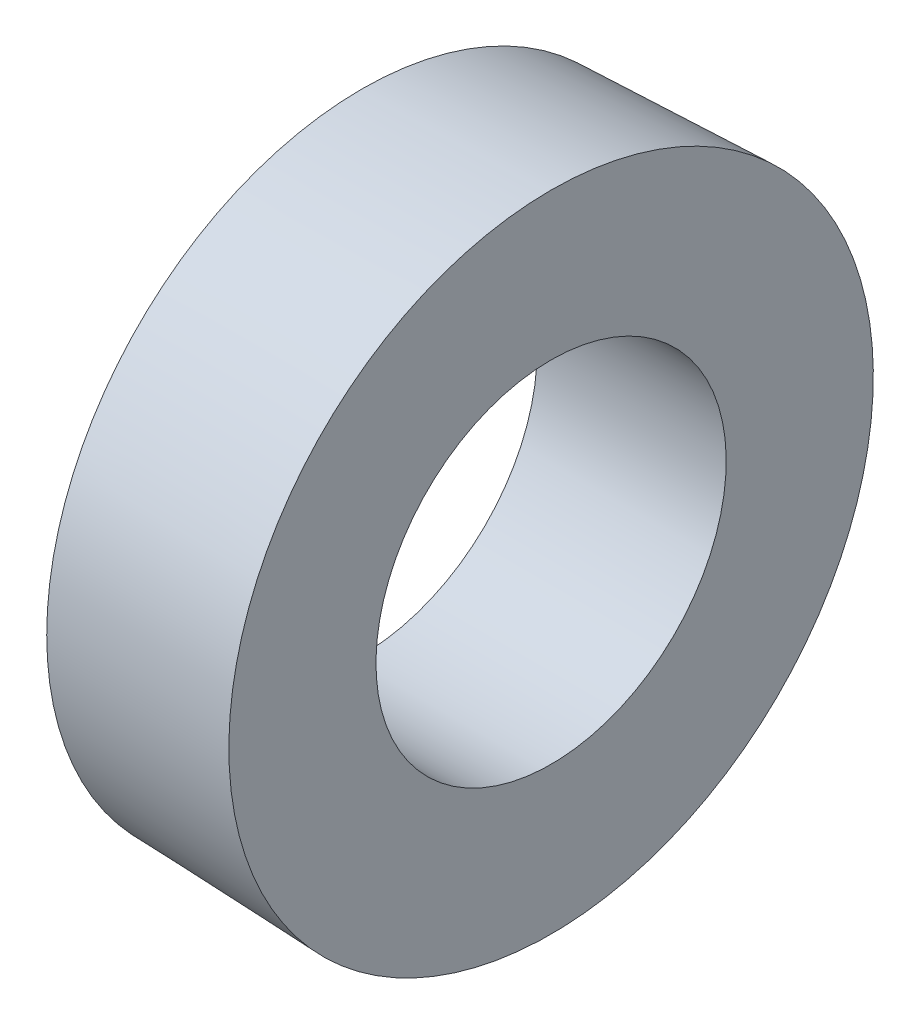
ISO-10303-21;
HEADER;
FILE_DESCRIPTION(('STEP AP214'),'2;1');
FILE_NAME('part.step','',(''),(''),'','','');
FILE_SCHEMA(('AUTOMOTIVE_DESIGN { 1 0 10303 214 1 1 1 1 }'));
ENDSEC;
DATA;
#1=APPLICATION_CONTEXT('core data for automotive mechanical design processes');
#2=APPLICATION_PROTOCOL_DEFINITION('international standard','automotive_design',2000,#1);
#3=PRODUCT_CONTEXT('',#1,'mechanical');
#4=PRODUCT('Part','Part','',(#3));
#5=PRODUCT_RELATED_PRODUCT_CATEGORY('part','',(#4));
#6=PRODUCT_DEFINITION_FORMATION('','',#4);
#7=PRODUCT_DEFINITION_CONTEXT('part definition',#1,'design');
#8=PRODUCT_DEFINITION('design','',#6,#7);
#9=PRODUCT_DEFINITION_SHAPE('','',#8);
#10=(LENGTH_UNIT() NAMED_UNIT(*) SI_UNIT(.MILLI.,.METRE.));
#11=(NAMED_UNIT(*) PLANE_ANGLE_UNIT() SI_UNIT($,.RADIAN.));
#12=(NAMED_UNIT(*) SI_UNIT($,.STERADIAN.) SOLID_ANGLE_UNIT());
#13=UNCERTAINTY_MEASURE_WITH_UNIT(LENGTH_MEASURE(1.E-05),#10,'distance_accuracy_value','');
#14=(GEOMETRIC_REPRESENTATION_CONTEXT(3) GLOBAL_UNCERTAINTY_ASSIGNED_CONTEXT((#13)) GLOBAL_UNIT_ASSIGNED_CONTEXT((#10,
#11,#12)) REPRESENTATION_CONTEXT('',''));
#15=CARTESIAN_POINT('',(0.,0.,0.));
#16=DIRECTION('',(0.,0.,1.));
#17=DIRECTION('',(1.,0.,0.));
#18=AXIS2_PLACEMENT_3D('',#15,#16,#17);
#19=CARTESIAN_POINT('',(0.,0.,0.));
#20=DIRECTION('',(-1.,0.,0.));
#21=DIRECTION('',(0.,0.,1.));
#22=AXIS2_PLACEMENT_3D('',#19,#20,#21);
#23=CYLINDRICAL_SURFACE('',#22,250.);
#24=CARTESIAN_POINT('',(4480.,0.,0.));
#25=DIRECTION('',(-1.,0.,0.));
#26=DIRECTION('',(0.,0.,1.));
#27=AXIS2_PLACEMENT_3D('',#24,#25,#26);
#28=CIRCLE('',#27,250.);
#29=CARTESIAN_POINT('',(4480.,250.,-1.79489651492081E-06));
#30=VERTEX_POINT('',#29);
#31=CARTESIAN_POINT('',(4480.,250.,0.));
#32=VERTEX_POINT('',#31);
#33=EDGE_CURVE('E11',#30,#32,#28,.T.);
#34=ORIENTED_EDGE('',*,*,#33,.T.);
#35=DIRECTION('',(1.,0.,0.));
#36=VECTOR('',#35,1.);
#37=CARTESIAN_POINT('',(4750.,250.,0.));
#38=LINE('',#37,#36);
#39=CARTESIAN_POINT('',(4750.,250.,0.));
#40=VERTEX_POINT('',#39);
#41=EDGE_CURVE('E100',#32,#40,#38,.T.);
#42=ORIENTED_EDGE('',*,*,#41,.T.);
#43=CARTESIAN_POINT('',(4750.,0.,0.));
#44=DIRECTION('',(-1.,0.,0.));
#45=DIRECTION('',(0.,0.,1.));
#46=AXIS2_PLACEMENT_3D('',#43,#44,#45);
#47=CIRCLE('',#46,250.);
#48=CARTESIAN_POINT('',(4750.,250.,-1.79489651492081E-06));
#49=VERTEX_POINT('',#48);
#50=EDGE_CURVE('E80',#49,#40,#47,.T.);
#51=ORIENTED_EDGE('',*,*,#50,.F.);
#52=DIRECTION('',(1.,0.,0.));
#53=VECTOR('',#52,1.);
#54=CARTESIAN_POINT('',(4750.,250.,-1.79489651492081E-06));
#55=LINE('',#54,#53);
#56=EDGE_CURVE('E103',#30,#49,#55,.T.);
#57=ORIENTED_EDGE('',*,*,#56,.F.);
#58=EDGE_LOOP('',(#34,#42,#51,#57));
#59=FACE_BOUND('',#58,.T.);
#60=ADVANCED_FACE('F39',(#59),#23,.F.);
#61=CARTESIAN_POINT('',(4480.,250.,-1.79489651492081E-06));
#62=DIRECTION('',(1.,0.,0.));
#63=DIRECTION('',(0.,0.,-1.));
#64=AXIS2_PLACEMENT_3D('',#61,#62,#63);
#65=PLANE('',#64);
#66=CARTESIAN_POINT('',(4480.,0.,0.));
#67=DIRECTION('',(-1.,0.,0.));
#68=DIRECTION('',(0.,0.,1.));
#69=AXIS2_PLACEMENT_3D('',#66,#67,#68);
#70=CIRCLE('',#69,450.);
#71=CARTESIAN_POINT('',(4480.,450.,-3.23081372685745E-06));
#72=VERTEX_POINT('',#71);
#73=CARTESIAN_POINT('',(4480.,450.,0.));
#74=VERTEX_POINT('',#73);
#75=EDGE_CURVE('E50',#72,#74,#70,.T.);
#76=ORIENTED_EDGE('',*,*,#75,.T.);
#77=DIRECTION('',(0.,-1.,0.));
#78=VECTOR('',#77,1.);
#79=CARTESIAN_POINT('',(4480.,250.,0.));
#80=LINE('',#79,#78);
#81=EDGE_CURVE('E104',#74,#32,#80,.T.);
#82=ORIENTED_EDGE('',*,*,#81,.T.);
#83=ORIENTED_EDGE('',*,*,#33,.F.);
#84=DIRECTION('',(0.,-1.,7.17958605968322E-09));
#85=VECTOR('',#84,1.);
#86=CARTESIAN_POINT('',(4480.,250.,-1.79489651492081E-06));
#87=LINE('',#86,#85);
#88=EDGE_CURVE('E91',#72,#30,#87,.T.);
#89=ORIENTED_EDGE('',*,*,#88,.F.);
#90=EDGE_LOOP('',(#76,#82,#83,#89));
#91=FACE_BOUND('',#90,.T.);
#92=ADVANCED_FACE('F41',(#91),#65,.F.);
#93=CARTESIAN_POINT('',(4750.,0.,0.));
#94=DIRECTION('',(1.,0.,0.));
#95=DIRECTION('',(0.,0.,-1.));
#96=AXIS2_PLACEMENT_3D('',#93,#94,#95);
#97=CONICAL_SURFACE('',#96,460.,0.0370201158739301);
#98=CARTESIAN_POINT('',(4750.,0.,0.));
#99=DIRECTION('',(-1.,0.,0.));
#100=DIRECTION('',(0.,0.,1.));
#101=AXIS2_PLACEMENT_3D('',#98,#99,#100);
#102=CIRCLE('',#101,460.);
#103=CARTESIAN_POINT('',(4750.,460.,-3.30260958745428E-06));
#104=VERTEX_POINT('',#103);
#105=CARTESIAN_POINT('',(4750.,460.,0.));
#106=VERTEX_POINT('',#105);
#107=EDGE_CURVE('E89',#104,#106,#102,.T.);
#108=ORIENTED_EDGE('',*,*,#107,.T.);
#109=DIRECTION('',(-0.999314833766767,-0.0370116605098804,0.));
#110=VECTOR('',#109,1.);
#111=CARTESIAN_POINT('',(4480.,450.,0.));
#112=LINE('',#111,#110);
#113=EDGE_CURVE('E97',#106,#74,#112,.T.);
#114=ORIENTED_EDGE('',*,*,#113,.T.);
#115=ORIENTED_EDGE('',*,*,#75,.F.);
#116=DIRECTION('',(-0.999314833766767,-0.0370116605098804,2.65728401842465E-10));
#117=VECTOR('',#116,1.);
#118=CARTESIAN_POINT('',(4480.,450.,-3.23081372685745E-06));
#119=LINE('',#118,#117);
#120=EDGE_CURVE('E109',#104,#72,#119,.T.);
#121=ORIENTED_EDGE('',*,*,#120,.F.);
#122=EDGE_LOOP('',(#108,#114,#115,#121));
#123=FACE_BOUND('',#122,.T.);
#124=ADVANCED_FACE('F112',(#123),#97,.T.);
#125=CARTESIAN_POINT('',(4750.,460.,-3.30260958745428E-06));
#126=DIRECTION('',(-1.,0.,0.));
#127=DIRECTION('',(0.,0.,1.));
#128=AXIS2_PLACEMENT_3D('',#125,#126,#127);
#129=PLANE('',#128);
#130=DIRECTION('',(0.,1.,-7.17958605968322E-09));
#131=VECTOR('',#130,1.);
#132=CARTESIAN_POINT('',(4750.,460.,-3.30260958745428E-06));
#133=LINE('',#132,#131);
#134=EDGE_CURVE('E82',#49,#104,#133,.T.);
#135=ORIENTED_EDGE('',*,*,#134,.F.);
#136=ORIENTED_EDGE('',*,*,#50,.T.);
#137=DIRECTION('',(0.,1.,0.));
#138=VECTOR('',#137,1.);
#139=CARTESIAN_POINT('',(4750.,460.,0.));
#140=LINE('',#139,#138);
#141=EDGE_CURVE('E85',#40,#106,#140,.T.);
#142=ORIENTED_EDGE('',*,*,#141,.T.);
#143=ORIENTED_EDGE('',*,*,#107,.F.);
#144=EDGE_LOOP('',(#135,#136,#142,#143));
#145=FACE_BOUND('',#144,.T.);
#146=ADVANCED_FACE('F83',(#145),#129,.F.);
#147=CARTESIAN_POINT('',(0.,0.,0.));
#148=DIRECTION('',(0.,-7.17958605968322E-09,-1.));
#149=DIRECTION('',(-1.,0.,0.));
#150=AXIS2_PLACEMENT_3D('',#147,#148,#149);
#151=PLANE('',#150);
#152=ORIENTED_EDGE('',*,*,#56,.T.);
#153=ORIENTED_EDGE('',*,*,#134,.T.);
#154=ORIENTED_EDGE('',*,*,#120,.T.);
#155=ORIENTED_EDGE('',*,*,#88,.T.);
#156=EDGE_LOOP('',(#152,#153,#154,#155));
#157=FACE_BOUND('',#156,.T.);
#158=ADVANCED_FACE('F111',(#157),#151,.F.);
#159=CARTESIAN_POINT('',(0.,0.,0.));
#160=DIRECTION('',(0.,0.,-1.));
#161=DIRECTION('',(-1.,0.,0.));
#162=AXIS2_PLACEMENT_3D('',#159,#160,#161);
#163=PLANE('',#162);
#164=ORIENTED_EDGE('',*,*,#41,.F.);
#165=ORIENTED_EDGE('',*,*,#81,.F.);
#166=ORIENTED_EDGE('',*,*,#113,.F.);
#167=ORIENTED_EDGE('',*,*,#141,.F.);
#168=EDGE_LOOP('',(#164,#165,#166,#167));
#169=FACE_BOUND('',#168,.T.);
#170=ADVANCED_FACE('F94',(#169),#163,.T.);
#171=CLOSED_SHELL('',(#60,#92,#124,#146,#158,#170));
#172=MANIFOLD_SOLID_BREP('B2',#171);
#173=ADVANCED_BREP_SHAPE_REPRESENTATION('',(#18,#172),#14);
#174=SHAPE_DEFINITION_REPRESENTATION(#9,#173);
ENDSEC;
END-ISO-10303-21;
